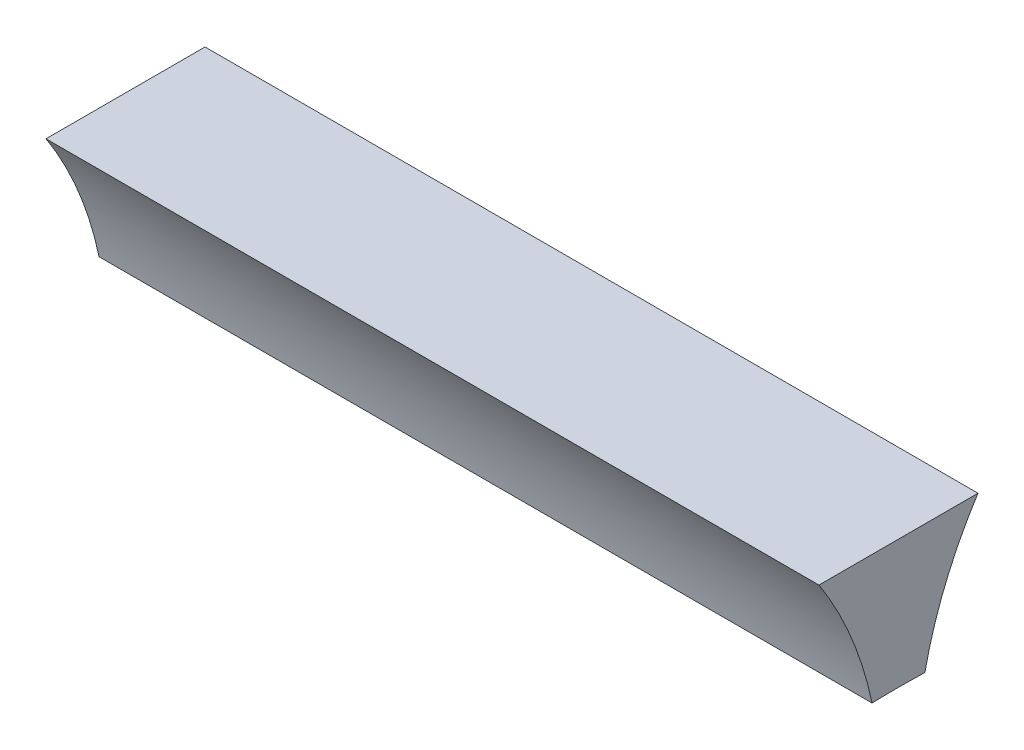
ISO-10303-21;
HEADER;
FILE_DESCRIPTION(('STEP AP214'),'2;1');
FILE_NAME('part.step','',(''),(''),'','','');
FILE_SCHEMA(('AUTOMOTIVE_DESIGN { 1 0 10303 214 1 1 1 1 }'));
ENDSEC;
DATA;
#1=APPLICATION_CONTEXT('core data for automotive mechanical design processes');
#2=APPLICATION_PROTOCOL_DEFINITION('international standard','automotive_design',2000,#1);
#3=PRODUCT_CONTEXT('',#1,'mechanical');
#4=PRODUCT('Part','Part','',(#3));
#5=PRODUCT_RELATED_PRODUCT_CATEGORY('part','',(#4));
#6=PRODUCT_DEFINITION_FORMATION('','',#4);
#7=PRODUCT_DEFINITION_CONTEXT('part definition',#1,'design');
#8=PRODUCT_DEFINITION('design','',#6,#7);
#9=PRODUCT_DEFINITION_SHAPE('','',#8);
#10=(LENGTH_UNIT() NAMED_UNIT(*) SI_UNIT(.MILLI.,.METRE.));
#11=(NAMED_UNIT(*) PLANE_ANGLE_UNIT() SI_UNIT($,.RADIAN.));
#12=(NAMED_UNIT(*) SI_UNIT($,.STERADIAN.) SOLID_ANGLE_UNIT());
#13=UNCERTAINTY_MEASURE_WITH_UNIT(LENGTH_MEASURE(1.E-05),#10,'distance_accuracy_value','');
#14=(GEOMETRIC_REPRESENTATION_CONTEXT(3) GLOBAL_UNCERTAINTY_ASSIGNED_CONTEXT((#13)) GLOBAL_UNIT_ASSIGNED_CONTEXT((#10,
#11,#12)) REPRESENTATION_CONTEXT('',''));
#15=CARTESIAN_POINT('',(0.,0.,0.));
#16=DIRECTION('',(0.,0.,1.));
#17=DIRECTION('',(1.,0.,0.));
#18=AXIS2_PLACEMENT_3D('',#15,#16,#17);
#19=CARTESIAN_POINT('',(20.,20.8175667929053,-10.3699186387364));
#20=DIRECTION('',(-1.,0.,0.));
#21=DIRECTION('',(0.,0.,1.));
#22=AXIS2_PLACEMENT_3D('',#19,#20,#21);
#23=CYLINDRICAL_SURFACE('',#22,9.9);
#24=CARTESIAN_POINT('',(0.,20.8175667929053,-10.3699186387364));
#25=DIRECTION('',(-1.,0.,0.));
#26=DIRECTION('',(0.,0.,-1.));
#27=AXIS2_PLACEMENT_3D('',#24,#25,#26);
#28=CIRCLE('',#27,9.9);
#29=CARTESIAN_POINT('',(0.,22.8637801548649,-0.683690741492918));
#30=VERTEX_POINT('',#29);
#31=CARTESIAN_POINT('',(0.,26.1947193310051,-2.05750439364449));
#32=VERTEX_POINT('',#31);
#33=EDGE_CURVE('E98',#30,#32,#28,.T.);
#34=ORIENTED_EDGE('',*,*,#33,.T.);
#35=DIRECTION('',(-1.,0.,0.));
#36=VECTOR('',#35,1.);
#37=CARTESIAN_POINT('',(20.,26.1947193310051,-2.05750439364449));
#38=LINE('',#37,#36);
#39=CARTESIAN_POINT('',(20.,26.1947193310051,-2.05750439364449));
#40=VERTEX_POINT('',#39);
#41=EDGE_CURVE('E11',#40,#32,#38,.T.);
#42=ORIENTED_EDGE('',*,*,#41,.F.);
#43=CARTESIAN_POINT('',(20.,20.8175667929053,-10.3699186387364));
#44=DIRECTION('',(-1.,0.,0.));
#45=DIRECTION('',(0.,0.,-1.));
#46=AXIS2_PLACEMENT_3D('',#43,#44,#45);
#47=CIRCLE('',#46,9.9);
#48=CARTESIAN_POINT('',(20.,22.8637801548649,-0.683690741492918));
#49=VERTEX_POINT('',#48);
#50=EDGE_CURVE('E86',#49,#40,#47,.T.);
#51=ORIENTED_EDGE('',*,*,#50,.F.);
#52=DIRECTION('',(-1.,0.,0.));
#53=VECTOR('',#52,1.);
#54=CARTESIAN_POINT('',(20.,22.8637801548649,-0.683690741492918));
#55=LINE('',#54,#53);
#56=EDGE_CURVE('E94',#49,#30,#55,.T.);
#57=ORIENTED_EDGE('',*,*,#56,.T.);
#58=EDGE_LOOP('',(#34,#42,#51,#57));
#59=FACE_BOUND('',#58,.T.);
#60=ADVANCED_FACE('F35',(#59),#23,.F.);
#61=CARTESIAN_POINT('',(20.,26.1947193310051,2.05750439364449));
#62=DIRECTION('',(0.,-1.,0.));
#63=DIRECTION('',(0.,0.,-1.));
#64=AXIS2_PLACEMENT_3D('',#61,#62,#63);
#65=PLANE('',#64);
#66=DIRECTION('',(0.,0.,1.));
#67=VECTOR('',#66,1.);
#68=CARTESIAN_POINT('',(0.,26.1947193310051,2.05750439364449));
#69=LINE('',#68,#67);
#70=CARTESIAN_POINT('',(0.,26.1947193310051,2.05750439364449));
#71=VERTEX_POINT('',#70);
#72=EDGE_CURVE('E90',#32,#71,#69,.T.);
#73=ORIENTED_EDGE('',*,*,#72,.T.);
#74=DIRECTION('',(-1.,0.,0.));
#75=VECTOR('',#74,1.);
#76=CARTESIAN_POINT('',(20.,26.1947193310051,2.05750439364449));
#77=LINE('',#76,#75);
#78=CARTESIAN_POINT('',(20.,26.1947193310051,2.05750439364449));
#79=VERTEX_POINT('',#78);
#80=EDGE_CURVE('E43',#79,#71,#77,.T.);
#81=ORIENTED_EDGE('',*,*,#80,.F.);
#82=DIRECTION('',(0.,0.,1.));
#83=VECTOR('',#82,1.);
#84=CARTESIAN_POINT('',(20.,26.1947193310051,2.05750439364449));
#85=LINE('',#84,#83);
#86=EDGE_CURVE('E81',#40,#79,#85,.T.);
#87=ORIENTED_EDGE('',*,*,#86,.F.);
#88=ORIENTED_EDGE('',*,*,#41,.T.);
#89=EDGE_LOOP('',(#73,#81,#87,#88));
#90=FACE_BOUND('',#89,.T.);
#91=ADVANCED_FACE('F89',(#90),#65,.F.);
#92=CARTESIAN_POINT('',(20.,20.8175667929053,10.3699186387364));
#93=DIRECTION('',(-1.,0.,0.));
#94=DIRECTION('',(0.,0.,1.));
#95=AXIS2_PLACEMENT_3D('',#92,#93,#94);
#96=CYLINDRICAL_SURFACE('',#95,9.9);
#97=CARTESIAN_POINT('',(0.,20.8175667929053,10.3699186387364));
#98=DIRECTION('',(-1.,0.,0.));
#99=DIRECTION('',(0.,0.,-1.));
#100=AXIS2_PLACEMENT_3D('',#97,#98,#99);
#101=CIRCLE('',#100,9.9);
#102=CARTESIAN_POINT('',(0.,22.8637801548649,0.68369074149292));
#103=VERTEX_POINT('',#102);
#104=EDGE_CURVE('E68',#71,#103,#101,.T.);
#105=ORIENTED_EDGE('',*,*,#104,.T.);
#106=DIRECTION('',(-1.,0.,0.));
#107=VECTOR('',#106,1.);
#108=CARTESIAN_POINT('',(20.,22.8637801548649,0.68369074149292));
#109=LINE('',#108,#107);
#110=CARTESIAN_POINT('',(20.,22.8637801548649,0.68369074149292));
#111=VERTEX_POINT('',#110);
#112=EDGE_CURVE('E91',#111,#103,#109,.T.);
#113=ORIENTED_EDGE('',*,*,#112,.F.);
#114=CARTESIAN_POINT('',(20.,20.8175667929053,10.3699186387364));
#115=DIRECTION('',(-1.,0.,0.));
#116=DIRECTION('',(0.,0.,-1.));
#117=AXIS2_PLACEMENT_3D('',#114,#115,#116);
#118=CIRCLE('',#117,9.9);
#119=EDGE_CURVE('E84',#79,#111,#118,.T.);
#120=ORIENTED_EDGE('',*,*,#119,.F.);
#121=ORIENTED_EDGE('',*,*,#80,.T.);
#122=EDGE_LOOP('',(#105,#113,#120,#121));
#123=FACE_BOUND('',#122,.T.);
#124=ADVANCED_FACE('F92',(#123),#96,.F.);
#125=CARTESIAN_POINT('',(20.,0.,0.));
#126=DIRECTION('',(-1.,0.,0.));
#127=DIRECTION('',(0.,0.,1.));
#128=AXIS2_PLACEMENT_3D('',#125,#126,#127);
#129=CYLINDRICAL_SURFACE('',#128,22.874);
#130=CARTESIAN_POINT('',(0.,0.,0.));
#131=DIRECTION('',(-1.,0.,0.));
#132=DIRECTION('',(0.,0.,-1.));
#133=AXIS2_PLACEMENT_3D('',#130,#131,#132);
#134=CIRCLE('',#133,22.874);
#135=EDGE_CURVE('E74',#103,#30,#134,.T.);
#136=ORIENTED_EDGE('',*,*,#135,.T.);
#137=ORIENTED_EDGE('',*,*,#56,.F.);
#138=CARTESIAN_POINT('',(20.,0.,0.));
#139=DIRECTION('',(-1.,0.,0.));
#140=DIRECTION('',(0.,0.,-1.));
#141=AXIS2_PLACEMENT_3D('',#138,#139,#140);
#142=CIRCLE('',#141,22.874);
#143=EDGE_CURVE('E51',#111,#49,#142,.T.);
#144=ORIENTED_EDGE('',*,*,#143,.F.);
#145=ORIENTED_EDGE('',*,*,#112,.T.);
#146=EDGE_LOOP('',(#136,#137,#144,#145));
#147=FACE_BOUND('',#146,.T.);
#148=ADVANCED_FACE('F105',(#147),#129,.F.);
#149=CARTESIAN_POINT('',(20.,20.8175667929053,-10.3699186387364));
#150=DIRECTION('',(1.,0.,0.));
#151=DIRECTION('',(0.,0.,-1.));
#152=AXIS2_PLACEMENT_3D('',#149,#150,#151);
#153=PLANE('',#152);
#154=ORIENTED_EDGE('',*,*,#50,.T.);
#155=ORIENTED_EDGE('',*,*,#86,.T.);
#156=ORIENTED_EDGE('',*,*,#119,.T.);
#157=ORIENTED_EDGE('',*,*,#143,.T.);
#158=EDGE_LOOP('',(#154,#155,#156,#157));
#159=FACE_BOUND('',#158,.T.);
#160=ADVANCED_FACE('F82',(#159),#153,.T.);
#161=CARTESIAN_POINT('',(0.,20.8175667929053,-10.3699186387364));
#162=DIRECTION('',(1.,0.,0.));
#163=DIRECTION('',(0.,0.,-1.));
#164=AXIS2_PLACEMENT_3D('',#161,#162,#163);
#165=PLANE('',#164);
#166=ORIENTED_EDGE('',*,*,#33,.F.);
#167=ORIENTED_EDGE('',*,*,#135,.F.);
#168=ORIENTED_EDGE('',*,*,#104,.F.);
#169=ORIENTED_EDGE('',*,*,#72,.F.);
#170=EDGE_LOOP('',(#166,#167,#168,#169));
#171=FACE_BOUND('',#170,.T.);
#172=ADVANCED_FACE('F108',(#171),#165,.F.);
#173=CLOSED_SHELL('',(#60,#91,#124,#148,#160,#172));
#174=MANIFOLD_SOLID_BREP('B2',#173);
#175=ADVANCED_BREP_SHAPE_REPRESENTATION('',(#18,#174),#14);
#176=SHAPE_DEFINITION_REPRESENTATION(#9,#175);
ENDSEC;
END-ISO-10303-21;
